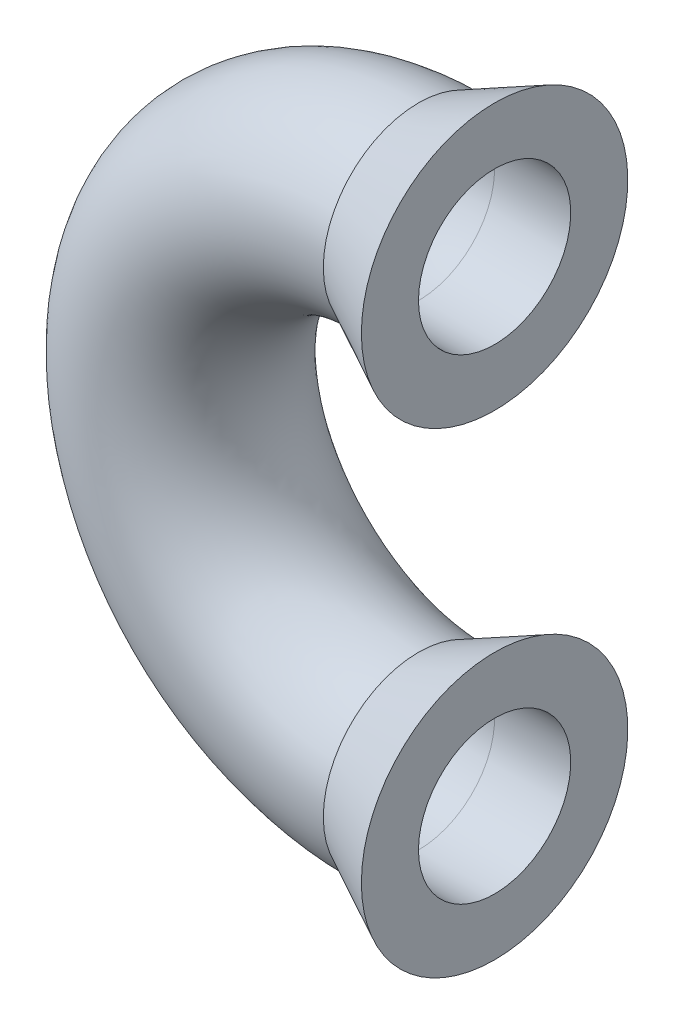
ISO-10303-21;
HEADER;
FILE_DESCRIPTION(('STEP AP214'),'2;1');
FILE_NAME('part.step','',(''),(''),'','','');
FILE_SCHEMA(('AUTOMOTIVE_DESIGN { 1 0 10303 214 1 1 1 1 }'));
ENDSEC;
DATA;
#1=APPLICATION_CONTEXT('core data for automotive mechanical design processes');
#2=APPLICATION_PROTOCOL_DEFINITION('international standard','automotive_design',2000,#1);
#3=PRODUCT_CONTEXT('',#1,'mechanical');
#4=PRODUCT('Part','Part','',(#3));
#5=PRODUCT_RELATED_PRODUCT_CATEGORY('part','',(#4));
#6=PRODUCT_DEFINITION_FORMATION('','',#4);
#7=PRODUCT_DEFINITION_CONTEXT('part definition',#1,'design');
#8=PRODUCT_DEFINITION('design','',#6,#7);
#9=PRODUCT_DEFINITION_SHAPE('','',#8);
#10=(LENGTH_UNIT() NAMED_UNIT(*) SI_UNIT(.MILLI.,.METRE.));
#11=(NAMED_UNIT(*) PLANE_ANGLE_UNIT() SI_UNIT($,.RADIAN.));
#12=(NAMED_UNIT(*) SI_UNIT($,.STERADIAN.) SOLID_ANGLE_UNIT());
#13=UNCERTAINTY_MEASURE_WITH_UNIT(LENGTH_MEASURE(1.E-05),#10,'distance_accuracy_value','');
#14=(GEOMETRIC_REPRESENTATION_CONTEXT(3) GLOBAL_UNCERTAINTY_ASSIGNED_CONTEXT((#13)) GLOBAL_UNIT_ASSIGNED_CONTEXT((#10,
#11,#12)) REPRESENTATION_CONTEXT('',''));
#15=CARTESIAN_POINT('',(0.,0.,0.));
#16=DIRECTION('',(0.,0.,1.));
#17=DIRECTION('',(1.,0.,0.));
#18=AXIS2_PLACEMENT_3D('',#15,#16,#17);
#19=CARTESIAN_POINT('',(0.,0.,0.));
#20=DIRECTION('',(0.,0.,1.));
#21=DIRECTION('',(1.,0.,0.));
#22=AXIS2_PLACEMENT_3D('',#19,#20,#21);
#23=TOROIDAL_SURFACE('',#22,12.5,5.);
#24=CARTESIAN_POINT('',(0.,12.5,0.));
#25=DIRECTION('',(1.,0.,0.));
#26=DIRECTION('',(0.,0.,-1.));
#27=AXIS2_PLACEMENT_3D('',#24,#25,#26);
#28=CIRCLE('',#27,5.);
#29=CARTESIAN_POINT('',(0.,17.5,0.));
#30=VERTEX_POINT('',#29);
#31=EDGE_CURVE('E35',#30,#30,#28,.T.);
#32=CARTESIAN_POINT('',(0.,-12.5,0.));
#33=DIRECTION('',(-1.,0.,0.));
#34=DIRECTION('',(0.,0.,1.));
#35=AXIS2_PLACEMENT_3D('',#32,#33,#34);
#36=CIRCLE('',#35,5.);
#37=CARTESIAN_POINT('',(0.,-17.5,0.));
#38=VERTEX_POINT('',#37);
#39=EDGE_CURVE('E54',#38,#38,#36,.T.);
#40=CARTESIAN_POINT('',(0.,0.,0.));
#41=DIRECTION('',(0.,0.,1.));
#42=DIRECTION('',(1.,0.,0.));
#43=AXIS2_PLACEMENT_3D('',#40,#41,#42);
#44=CIRCLE('',#43,17.5);
#45=EDGE_CURVE('',#30,#38,#44,.T.);
#46=ORIENTED_EDGE('',*,*,#31,.F.);
#47=ORIENTED_EDGE('',*,*,#39,.T.);
#48=ORIENTED_EDGE('',*,*,#45,.T.);
#49=ORIENTED_EDGE('',*,*,#45,.F.);
#50=EDGE_LOOP('',(#46,#48,#47,#49));
#51=FACE_BOUND('',#50,.T.);
#52=ADVANCED_FACE('F32',(#51),#23,.T.);
#53=CARTESIAN_POINT('',(0.,0.,0.));
#54=DIRECTION('',(0.,0.,1.));
#55=DIRECTION('',(1.,0.,0.));
#56=AXIS2_PLACEMENT_3D('',#53,#54,#55);
#57=TOROIDAL_SURFACE('',#56,12.5,4.);
#58=CARTESIAN_POINT('',(0.,12.5,0.));
#59=DIRECTION('',(1.,0.,0.));
#60=DIRECTION('',(0.,0.,-1.));
#61=AXIS2_PLACEMENT_3D('',#58,#59,#60);
#62=CIRCLE('',#61,4.);
#63=CARTESIAN_POINT('',(0.,16.5,0.));
#64=VERTEX_POINT('',#63);
#65=EDGE_CURVE('E39',#64,#64,#62,.F.);
#66=CARTESIAN_POINT('',(0.,-12.5,0.));
#67=DIRECTION('',(-1.,0.,0.));
#68=DIRECTION('',(0.,0.,-1.));
#69=AXIS2_PLACEMENT_3D('',#66,#67,#68);
#70=CIRCLE('',#69,4.);
#71=CARTESIAN_POINT('',(0.,-16.5,0.));
#72=VERTEX_POINT('',#71);
#73=EDGE_CURVE('E10',#72,#72,#70,.F.);
#74=CARTESIAN_POINT('',(0.,0.,0.));
#75=DIRECTION('',(0.,0.,1.));
#76=DIRECTION('',(1.,0.,0.));
#77=AXIS2_PLACEMENT_3D('',#74,#75,#76);
#78=CIRCLE('',#77,16.5);
#79=EDGE_CURVE('',#64,#72,#78,.T.);
#80=ORIENTED_EDGE('',*,*,#65,.F.);
#81=ORIENTED_EDGE('',*,*,#73,.T.);
#82=ORIENTED_EDGE('',*,*,#79,.T.);
#83=ORIENTED_EDGE('',*,*,#79,.F.);
#84=EDGE_LOOP('',(#80,#82,#81,#83));
#85=FACE_BOUND('',#84,.T.);
#86=ADVANCED_FACE('F73',(#85),#57,.F.);
#87=CARTESIAN_POINT('',(4.,19.5,0.));
#88=DIRECTION('',(-1.,0.,0.));
#89=DIRECTION('',(0.,0.,1.));
#90=AXIS2_PLACEMENT_3D('',#87,#88,#89);
#91=PLANE('',#90);
#92=CARTESIAN_POINT('',(4.,12.5,0.));
#93=DIRECTION('',(-1.,0.,0.));
#94=DIRECTION('',(0.,0.,1.));
#95=AXIS2_PLACEMENT_3D('',#92,#93,#94);
#96=CIRCLE('',#95,6.99999999999997);
#97=CARTESIAN_POINT('',(4.,12.5,6.99999999999997));
#98=VERTEX_POINT('',#97);
#99=EDGE_CURVE('E45',#98,#98,#96,.T.);
#100=ORIENTED_EDGE('',*,*,#99,.F.);
#101=EDGE_LOOP('',(#100));
#102=FACE_BOUND('',#101,.T.);
#103=CARTESIAN_POINT('',(4.,12.5,0.));
#104=DIRECTION('',(-1.,0.,0.));
#105=DIRECTION('',(0.,0.,1.));
#106=AXIS2_PLACEMENT_3D('',#103,#104,#105);
#107=CIRCLE('',#106,4.);
#108=CARTESIAN_POINT('',(4.,12.5,4.));
#109=VERTEX_POINT('',#108);
#110=EDGE_CURVE('E48',#109,#109,#107,.T.);
#111=ORIENTED_EDGE('',*,*,#110,.T.);
#112=EDGE_LOOP('',(#111));
#113=FACE_BOUND('',#112,.T.);
#114=ADVANCED_FACE('F75',(#102,#113),#91,.F.);
#115=CARTESIAN_POINT('',(4.,12.5,0.));
#116=DIRECTION('',(1.,0.,0.));
#117=DIRECTION('',(0.,0.,-1.));
#118=AXIS2_PLACEMENT_3D('',#115,#116,#117);
#119=CONICAL_SURFACE('',#118,6.99999999999997,0.463647609000799);
#120=ORIENTED_EDGE('',*,*,#31,.T.);
#121=EDGE_LOOP('',(#120));
#122=FACE_BOUND('',#121,.T.);
#123=ORIENTED_EDGE('',*,*,#99,.T.);
#124=EDGE_LOOP('',(#123));
#125=FACE_BOUND('',#124,.T.);
#126=ADVANCED_FACE('F80',(#122,#125),#119,.T.);
#127=CARTESIAN_POINT('',(-2.91531698718186,12.5,0.));
#128=DIRECTION('',(-1.,0.,0.));
#129=DIRECTION('',(0.,0.,1.));
#130=AXIS2_PLACEMENT_3D('',#127,#128,#129);
#131=CYLINDRICAL_SURFACE('',#130,4.);
#132=ORIENTED_EDGE('',*,*,#110,.F.);
#133=EDGE_LOOP('',(#132));
#134=FACE_BOUND('',#133,.T.);
#135=ORIENTED_EDGE('',*,*,#65,.T.);
#136=EDGE_LOOP('',(#135));
#137=FACE_BOUND('',#136,.T.);
#138=ADVANCED_FACE('F88',(#134,#137),#131,.F.);
#139=CARTESIAN_POINT('',(4.,-5.50000000000003,0.));
#140=DIRECTION('',(-1.,0.,0.));
#141=DIRECTION('',(0.,0.,1.));
#142=AXIS2_PLACEMENT_3D('',#139,#140,#141);
#143=PLANE('',#142);
#144=CARTESIAN_POINT('',(4.,-12.5,0.));
#145=DIRECTION('',(-1.,0.,0.));
#146=DIRECTION('',(0.,0.,1.));
#147=AXIS2_PLACEMENT_3D('',#144,#145,#146);
#148=CIRCLE('',#147,6.99999999999997);
#149=CARTESIAN_POINT('',(4.,-12.5,6.99999999999997));
#150=VERTEX_POINT('',#149);
#151=EDGE_CURVE('E51',#150,#150,#148,.T.);
#152=ORIENTED_EDGE('',*,*,#151,.F.);
#153=EDGE_LOOP('',(#152));
#154=FACE_BOUND('',#153,.T.);
#155=CARTESIAN_POINT('',(4.,-12.5,0.));
#156=DIRECTION('',(-1.,0.,0.));
#157=DIRECTION('',(0.,0.,1.));
#158=AXIS2_PLACEMENT_3D('',#155,#156,#157);
#159=CIRCLE('',#158,4.);
#160=CARTESIAN_POINT('',(4.,-12.5,4.));
#161=VERTEX_POINT('',#160);
#162=EDGE_CURVE('E57',#161,#161,#159,.T.);
#163=ORIENTED_EDGE('',*,*,#162,.T.);
#164=EDGE_LOOP('',(#163));
#165=FACE_BOUND('',#164,.T.);
#166=ADVANCED_FACE('F61',(#154,#165),#143,.F.);
#167=CARTESIAN_POINT('',(4.,-12.5,0.));
#168=DIRECTION('',(1.,0.,0.));
#169=DIRECTION('',(0.,0.,-1.));
#170=AXIS2_PLACEMENT_3D('',#167,#168,#169);
#171=CONICAL_SURFACE('',#170,6.99999999999997,0.463647609000799);
#172=ORIENTED_EDGE('',*,*,#39,.F.);
#173=EDGE_LOOP('',(#172));
#174=FACE_BOUND('',#173,.T.);
#175=ORIENTED_EDGE('',*,*,#151,.T.);
#176=EDGE_LOOP('',(#175));
#177=FACE_BOUND('',#176,.T.);
#178=ADVANCED_FACE('F66',(#174,#177),#171,.T.);
#179=CARTESIAN_POINT('',(-1.97650581013181,-12.5,0.));
#180=DIRECTION('',(-1.,0.,0.));
#181=DIRECTION('',(0.,0.,1.));
#182=AXIS2_PLACEMENT_3D('',#179,#180,#181);
#183=CYLINDRICAL_SURFACE('',#182,4.);
#184=ORIENTED_EDGE('',*,*,#162,.F.);
#185=EDGE_LOOP('',(#184));
#186=FACE_BOUND('',#185,.T.);
#187=ORIENTED_EDGE('',*,*,#73,.F.);
#188=EDGE_LOOP('',(#187));
#189=FACE_BOUND('',#188,.T.);
#190=ADVANCED_FACE('F63',(#186,#189),#183,.F.);
#191=CLOSED_SHELL('',(#52,#86,#114,#126,#138,#166,#178,#190));
#192=MANIFOLD_SOLID_BREP('B2',#191);
#193=ADVANCED_BREP_SHAPE_REPRESENTATION('',(#18,#192),#14);
#194=SHAPE_DEFINITION_REPRESENTATION(#9,#193);
ENDSEC;
END-ISO-10303-21;
